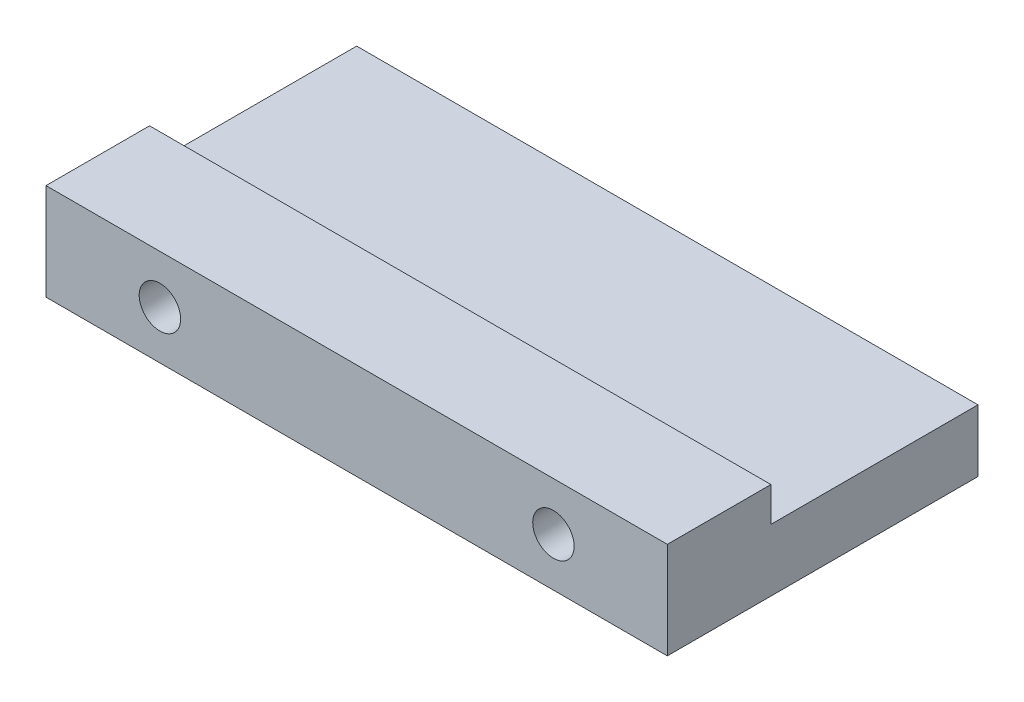
ISO-10303-21;
HEADER;
FILE_DESCRIPTION(('STEP AP214'),'2;1');
FILE_NAME('part.step','',(''),(''),'','','');
FILE_SCHEMA(('AUTOMOTIVE_DESIGN { 1 0 10303 214 1 1 1 1 }'));
ENDSEC;
DATA;
#1=APPLICATION_CONTEXT('core data for automotive mechanical design processes');
#2=APPLICATION_PROTOCOL_DEFINITION('international standard','automotive_design',2000,#1);
#3=PRODUCT_CONTEXT('',#1,'mechanical');
#4=PRODUCT('Part','Part','',(#3));
#5=PRODUCT_RELATED_PRODUCT_CATEGORY('part','',(#4));
#6=PRODUCT_DEFINITION_FORMATION('','',#4);
#7=PRODUCT_DEFINITION_CONTEXT('part definition',#1,'design');
#8=PRODUCT_DEFINITION('design','',#6,#7);
#9=PRODUCT_DEFINITION_SHAPE('','',#8);
#10=(LENGTH_UNIT() NAMED_UNIT(*) SI_UNIT(.MILLI.,.METRE.));
#11=(NAMED_UNIT(*) PLANE_ANGLE_UNIT() SI_UNIT($,.RADIAN.));
#12=(NAMED_UNIT(*) SI_UNIT($,.STERADIAN.) SOLID_ANGLE_UNIT());
#13=UNCERTAINTY_MEASURE_WITH_UNIT(LENGTH_MEASURE(1.E-05),#10,'distance_accuracy_value','');
#14=(GEOMETRIC_REPRESENTATION_CONTEXT(3) GLOBAL_UNCERTAINTY_ASSIGNED_CONTEXT((#13)) GLOBAL_UNIT_ASSIGNED_CONTEXT((#10,
#11,#12)) REPRESENTATION_CONTEXT('',''));
#15=CARTESIAN_POINT('',(0.,0.,0.));
#16=DIRECTION('',(0.,0.,1.));
#17=DIRECTION('',(1.,0.,0.));
#18=AXIS2_PLACEMENT_3D('',#15,#16,#17);
#19=CARTESIAN_POINT('',(147.,-14.,60.));
#20=DIRECTION('',(0.,0.,-1.));
#21=DIRECTION('',(-1.,0.,0.));
#22=AXIS2_PLACEMENT_3D('',#19,#20,#21);
#23=PLANE('',#22);
#24=DIRECTION('',(1.,0.,0.));
#25=VECTOR('',#24,1.);
#26=CARTESIAN_POINT('',(180.,-10.,60.));
#27=LINE('',#26,#25);
#28=CARTESIAN_POINT('',(142.527864045,-10.,60.));
#29=VERTEX_POINT('',#28);
#30=CARTESIAN_POINT('',(151.472135955,-10.,60.));
#31=VERTEX_POINT('',#30);
#32=EDGE_CURVE('E185',#29,#31,#27,.T.);
#33=ORIENTED_EDGE('',*,*,#32,.F.);
#34=CARTESIAN_POINT('',(147.,-14.,60.));
#35=DIRECTION('',(0.,0.,1.));
#36=DIRECTION('',(-1.,0.,0.));
#37=AXIS2_PLACEMENT_3D('',#34,#35,#36);
#38=CIRCLE('',#37,6.00000000000004);
#39=EDGE_CURVE('E120',#29,#31,#38,.T.);
#40=ORIENTED_EDGE('',*,*,#39,.T.);
#41=EDGE_LOOP('',(#33,#40));
#42=FACE_BOUND('',#41,.T.);
#43=ADVANCED_FACE('F31',(#42),#23,.F.);
#44=CARTESIAN_POINT('',(0.,0.,90.));
#45=DIRECTION('',(1.,0.,0.));
#46=DIRECTION('',(0.,1.,0.));
#47=AXIS2_PLACEMENT_3D('',#44,#45,#46);
#48=PLANE('',#47);
#49=DIRECTION('',(0.,0.,-1.));
#50=VECTOR('',#49,1.);
#51=CARTESIAN_POINT('',(0.,0.,90.));
#52=LINE('',#51,#50);
#53=CARTESIAN_POINT('',(0.,0.,90.));
#54=VERTEX_POINT('',#53);
#55=CARTESIAN_POINT('',(0.,0.,60.));
#56=VERTEX_POINT('',#55);
#57=EDGE_CURVE('E128',#54,#56,#52,.T.);
#58=ORIENTED_EDGE('',*,*,#57,.T.);
#59=DIRECTION('',(0.,1.,0.));
#60=VECTOR('',#59,1.);
#61=CARTESIAN_POINT('',(0.,-10.,60.));
#62=LINE('',#61,#60);
#63=CARTESIAN_POINT('',(0.,-10.,60.));
#64=VERTEX_POINT('',#63);
#65=EDGE_CURVE('E111',#64,#56,#62,.T.);
#66=ORIENTED_EDGE('',*,*,#65,.F.);
#67=DIRECTION('',(0.,0.,1.));
#68=VECTOR('',#67,1.);
#69=CARTESIAN_POINT('',(0.,-10.,0.));
#70=LINE('',#69,#68);
#71=CARTESIAN_POINT('',(0.,-10.,0.));
#72=VERTEX_POINT('',#71);
#73=EDGE_CURVE('E97',#72,#64,#70,.T.);
#74=ORIENTED_EDGE('',*,*,#73,.F.);
#75=DIRECTION('',(0.,-1.,0.));
#76=VECTOR('',#75,1.);
#77=CARTESIAN_POINT('',(0.,0.,0.));
#78=LINE('',#77,#76);
#79=CARTESIAN_POINT('',(0.,-28.,0.));
#80=VERTEX_POINT('',#79);
#81=EDGE_CURVE('E109',#72,#80,#78,.T.);
#82=ORIENTED_EDGE('',*,*,#81,.T.);
#83=DIRECTION('',(0.,0.,-1.));
#84=VECTOR('',#83,1.);
#85=CARTESIAN_POINT('',(0.,-28.,90.));
#86=LINE('',#85,#84);
#87=CARTESIAN_POINT('',(0.,-28.,90.));
#88=VERTEX_POINT('',#87);
#89=EDGE_CURVE('E11',#88,#80,#86,.T.);
#90=ORIENTED_EDGE('',*,*,#89,.F.);
#91=DIRECTION('',(0.,-1.,0.));
#92=VECTOR('',#91,1.);
#93=CARTESIAN_POINT('',(0.,0.,90.));
#94=LINE('',#93,#92);
#95=EDGE_CURVE('E127',#54,#88,#94,.T.);
#96=ORIENTED_EDGE('',*,*,#95,.F.);
#97=EDGE_LOOP('',(#58,#66,#74,#82,#90,#96));
#98=FACE_BOUND('',#97,.T.);
#99=ADVANCED_FACE('F33',(#98),#48,.F.);
#100=CARTESIAN_POINT('',(0.,-28.,90.));
#101=DIRECTION('',(0.,1.,0.));
#102=DIRECTION('',(0.,0.,1.));
#103=AXIS2_PLACEMENT_3D('',#100,#101,#102);
#104=PLANE('',#103);
#105=DIRECTION('',(1.,0.,0.));
#106=VECTOR('',#105,1.);
#107=CARTESIAN_POINT('',(0.,-28.,0.));
#108=LINE('',#107,#106);
#109=CARTESIAN_POINT('',(180.,-28.,0.));
#110=VERTEX_POINT('',#109);
#111=EDGE_CURVE('E115',#80,#110,#108,.T.);
#112=ORIENTED_EDGE('',*,*,#111,.T.);
#113=DIRECTION('',(0.,0.,-1.));
#114=VECTOR('',#113,1.);
#115=CARTESIAN_POINT('',(180.,-28.,90.));
#116=LINE('',#115,#114);
#117=CARTESIAN_POINT('',(180.,-28.,90.));
#118=VERTEX_POINT('',#117);
#119=EDGE_CURVE('E39',#118,#110,#116,.T.);
#120=ORIENTED_EDGE('',*,*,#119,.F.);
#121=DIRECTION('',(1.,0.,0.));
#122=VECTOR('',#121,1.);
#123=CARTESIAN_POINT('',(0.,-28.,90.));
#124=LINE('',#123,#122);
#125=EDGE_CURVE('E141',#88,#118,#124,.T.);
#126=ORIENTED_EDGE('',*,*,#125,.F.);
#127=ORIENTED_EDGE('',*,*,#89,.T.);
#128=EDGE_LOOP('',(#112,#120,#126,#127));
#129=FACE_BOUND('',#128,.T.);
#130=ADVANCED_FACE('F140',(#129),#104,.F.);
#131=CARTESIAN_POINT('',(180.,0.,90.));
#132=DIRECTION('',(-1.,0.,0.));
#133=DIRECTION('',(0.,0.,1.));
#134=AXIS2_PLACEMENT_3D('',#131,#132,#133);
#135=PLANE('',#134);
#136=DIRECTION('',(0.,0.,-1.));
#137=VECTOR('',#136,1.);
#138=CARTESIAN_POINT('',(180.,-10.,0.));
#139=LINE('',#138,#137);
#140=CARTESIAN_POINT('',(180.,-10.,60.));
#141=VERTEX_POINT('',#140);
#142=CARTESIAN_POINT('',(180.,-10.,0.));
#143=VERTEX_POINT('',#142);
#144=EDGE_CURVE('E99',#141,#143,#139,.T.);
#145=ORIENTED_EDGE('',*,*,#144,.F.);
#146=DIRECTION('',(0.,1.,0.));
#147=VECTOR('',#146,1.);
#148=CARTESIAN_POINT('',(180.,-10.,60.));
#149=LINE('',#148,#147);
#150=CARTESIAN_POINT('',(180.,0.,60.));
#151=VERTEX_POINT('',#150);
#152=EDGE_CURVE('E163',#141,#151,#149,.T.);
#153=ORIENTED_EDGE('',*,*,#152,.T.);
#154=DIRECTION('',(0.,0.,-1.));
#155=VECTOR('',#154,1.);
#156=CARTESIAN_POINT('',(180.,0.,90.));
#157=LINE('',#156,#155);
#158=CARTESIAN_POINT('',(180.,0.,90.));
#159=VERTEX_POINT('',#158);
#160=EDGE_CURVE('E130',#159,#151,#157,.T.);
#161=ORIENTED_EDGE('',*,*,#160,.F.);
#162=DIRECTION('',(0.,1.,0.));
#163=VECTOR('',#162,1.);
#164=CARTESIAN_POINT('',(180.,0.,90.));
#165=LINE('',#164,#163);
#166=EDGE_CURVE('E138',#118,#159,#165,.T.);
#167=ORIENTED_EDGE('',*,*,#166,.F.);
#168=ORIENTED_EDGE('',*,*,#119,.T.);
#169=DIRECTION('',(0.,1.,0.));
#170=VECTOR('',#169,1.);
#171=CARTESIAN_POINT('',(180.,0.,0.));
#172=LINE('',#171,#170);
#173=EDGE_CURVE('E118',#110,#143,#172,.T.);
#174=ORIENTED_EDGE('',*,*,#173,.T.);
#175=EDGE_LOOP('',(#145,#153,#161,#167,#168,#174));
#176=FACE_BOUND('',#175,.T.);
#177=ADVANCED_FACE('F136',(#176),#135,.F.);
#178=CARTESIAN_POINT('',(0.,0.,90.));
#179=DIRECTION('',(0.,-1.,0.));
#180=DIRECTION('',(0.,0.,-1.));
#181=AXIS2_PLACEMENT_3D('',#178,#179,#180);
#182=PLANE('',#181);
#183=ORIENTED_EDGE('',*,*,#160,.T.);
#184=DIRECTION('',(1.,0.,0.));
#185=VECTOR('',#184,1.);
#186=CARTESIAN_POINT('',(180.,0.,60.));
#187=LINE('',#186,#185);
#188=EDGE_CURVE('E155',#56,#151,#187,.T.);
#189=ORIENTED_EDGE('',*,*,#188,.F.);
#190=ORIENTED_EDGE('',*,*,#57,.F.);
#191=DIRECTION('',(-1.,0.,0.));
#192=VECTOR('',#191,1.);
#193=CARTESIAN_POINT('',(0.,0.,90.));
#194=LINE('',#193,#192);
#195=EDGE_CURVE('E123',#159,#54,#194,.T.);
#196=ORIENTED_EDGE('',*,*,#195,.F.);
#197=EDGE_LOOP('',(#183,#189,#190,#196));
#198=FACE_BOUND('',#197,.T.);
#199=ADVANCED_FACE('F154',(#198),#182,.F.);
#200=CARTESIAN_POINT('',(0.,-28.,90.));
#201=DIRECTION('',(0.,0.,1.));
#202=DIRECTION('',(1.,0.,0.));
#203=AXIS2_PLACEMENT_3D('',#200,#201,#202);
#204=PLANE('',#203);
#205=CARTESIAN_POINT('',(33.,-14.,90.));
#206=DIRECTION('',(0.,0.,1.));
#207=DIRECTION('',(1.,0.,0.));
#208=AXIS2_PLACEMENT_3D('',#205,#206,#207);
#209=CIRCLE('',#208,6.);
#210=CARTESIAN_POINT('',(39.,-14.,90.));
#211=VERTEX_POINT('',#210);
#212=EDGE_CURVE('E165',#211,#211,#209,.T.);
#213=ORIENTED_EDGE('',*,*,#212,.F.);
#214=EDGE_LOOP('',(#213));
#215=FACE_BOUND('',#214,.T.);
#216=CARTESIAN_POINT('',(147.,-14.,90.));
#217=DIRECTION('',(0.,0.,1.));
#218=DIRECTION('',(-1.,0.,0.));
#219=AXIS2_PLACEMENT_3D('',#216,#217,#218);
#220=CIRCLE('',#219,6.00000000000004);
#221=CARTESIAN_POINT('',(141.,-14.,90.));
#222=VERTEX_POINT('',#221);
#223=EDGE_CURVE('E149',#222,#222,#220,.T.);
#224=ORIENTED_EDGE('',*,*,#223,.F.);
#225=EDGE_LOOP('',(#224));
#226=FACE_BOUND('',#225,.T.);
#227=ORIENTED_EDGE('',*,*,#95,.T.);
#228=ORIENTED_EDGE('',*,*,#125,.T.);
#229=ORIENTED_EDGE('',*,*,#166,.T.);
#230=ORIENTED_EDGE('',*,*,#195,.T.);
#231=EDGE_LOOP('',(#227,#228,#229,#230));
#232=FACE_BOUND('',#231,.T.);
#233=ADVANCED_FACE('F151',(#215,#226,#232),#204,.T.);
#234=CARTESIAN_POINT('',(0.,-28.,0.));
#235=DIRECTION('',(0.,0.,1.));
#236=DIRECTION('',(1.,0.,0.));
#237=AXIS2_PLACEMENT_3D('',#234,#235,#236);
#238=PLANE('',#237);
#239=ORIENTED_EDGE('',*,*,#81,.F.);
#240=DIRECTION('',(-1.,0.,0.));
#241=VECTOR('',#240,1.);
#242=CARTESIAN_POINT('',(180.,-10.,0.));
#243=LINE('',#242,#241);
#244=EDGE_CURVE('E94',#143,#72,#243,.T.);
#245=ORIENTED_EDGE('',*,*,#244,.F.);
#246=ORIENTED_EDGE('',*,*,#173,.F.);
#247=ORIENTED_EDGE('',*,*,#111,.F.);
#248=EDGE_LOOP('',(#239,#245,#246,#247));
#249=FACE_BOUND('',#248,.T.);
#250=ADVANCED_FACE('F114',(#249),#238,.F.);
#251=CARTESIAN_POINT('',(147.,-14.,60.));
#252=DIRECTION('',(0.,0.,1.));
#253=DIRECTION('',(1.,0.,0.));
#254=AXIS2_PLACEMENT_3D('',#251,#252,#253);
#255=CYLINDRICAL_SURFACE('',#254,6.00000000000004);
#256=EDGE_CURVE('E116',#31,#29,#38,.T.);
#257=ORIENTED_EDGE('',*,*,#256,.F.);
#258=ORIENTED_EDGE('',*,*,#39,.F.);
#259=EDGE_LOOP('',(#257,#258));
#260=FACE_BOUND('',#259,.T.);
#261=ORIENTED_EDGE('',*,*,#223,.T.);
#262=EDGE_LOOP('',(#261));
#263=FACE_BOUND('',#262,.T.);
#264=ADVANCED_FACE('F190',(#260,#263),#255,.F.);
#265=CARTESIAN_POINT('',(33.,-14.,60.));
#266=DIRECTION('',(0.,0.,1.));
#267=DIRECTION('',(1.,0.,0.));
#268=AXIS2_PLACEMENT_3D('',#265,#266,#267);
#269=CYLINDRICAL_SURFACE('',#268,6.);
#270=CARTESIAN_POINT('',(33.,-14.,60.));
#271=DIRECTION('',(0.,0.,1.));
#272=DIRECTION('',(1.,0.,0.));
#273=AXIS2_PLACEMENT_3D('',#270,#271,#272);
#274=CIRCLE('',#273,6.);
#275=CARTESIAN_POINT('',(37.4721359549997,-10.,60.));
#276=VERTEX_POINT('',#275);
#277=CARTESIAN_POINT('',(28.5278640450005,-10.,60.));
#278=VERTEX_POINT('',#277);
#279=EDGE_CURVE('E167',#276,#278,#274,.T.);
#280=ORIENTED_EDGE('',*,*,#279,.F.);
#281=EDGE_CURVE('E169',#278,#276,#274,.T.);
#282=ORIENTED_EDGE('',*,*,#281,.F.);
#283=EDGE_LOOP('',(#280,#282));
#284=FACE_BOUND('',#283,.T.);
#285=ORIENTED_EDGE('',*,*,#212,.T.);
#286=EDGE_LOOP('',(#285));
#287=FACE_BOUND('',#286,.T.);
#288=ADVANCED_FACE('F181',(#284,#287),#269,.F.);
#289=CARTESIAN_POINT('',(33.,-14.,60.));
#290=DIRECTION('',(0.,0.,1.));
#291=DIRECTION('',(1.,0.,0.));
#292=AXIS2_PLACEMENT_3D('',#289,#290,#291);
#293=PLANE('',#292);
#294=EDGE_CURVE('E179',#278,#276,#27,.T.);
#295=ORIENTED_EDGE('',*,*,#294,.F.);
#296=ORIENTED_EDGE('',*,*,#281,.T.);
#297=EDGE_LOOP('',(#295,#296));
#298=FACE_BOUND('',#297,.T.);
#299=ADVANCED_FACE('F178',(#298),#293,.T.);
#300=CARTESIAN_POINT('',(180.,-10.,60.));
#301=DIRECTION('',(0.,0.,1.));
#302=DIRECTION('',(1.,0.,0.));
#303=AXIS2_PLACEMENT_3D('',#300,#301,#302);
#304=PLANE('',#303);
#305=ORIENTED_EDGE('',*,*,#256,.T.);
#306=EDGE_CURVE('E46',#276,#29,#27,.T.);
#307=ORIENTED_EDGE('',*,*,#306,.F.);
#308=ORIENTED_EDGE('',*,*,#279,.T.);
#309=EDGE_CURVE('E52',#64,#278,#27,.T.);
#310=ORIENTED_EDGE('',*,*,#309,.F.);
#311=ORIENTED_EDGE('',*,*,#65,.T.);
#312=ORIENTED_EDGE('',*,*,#188,.T.);
#313=ORIENTED_EDGE('',*,*,#152,.F.);
#314=EDGE_CURVE('E112',#31,#141,#27,.T.);
#315=ORIENTED_EDGE('',*,*,#314,.F.);
#316=EDGE_LOOP('',(#305,#307,#308,#310,#311,#312,#313,#315));
#317=FACE_BOUND('',#316,.T.);
#318=ADVANCED_FACE('F182',(#317),#304,.F.);
#319=CARTESIAN_POINT('',(180.,-10.,0.));
#320=DIRECTION('',(0.,-1.,0.));
#321=DIRECTION('',(0.,0.,-1.));
#322=AXIS2_PLACEMENT_3D('',#319,#320,#321);
#323=PLANE('',#322);
#324=ORIENTED_EDGE('',*,*,#144,.T.);
#325=ORIENTED_EDGE('',*,*,#244,.T.);
#326=ORIENTED_EDGE('',*,*,#73,.T.);
#327=ORIENTED_EDGE('',*,*,#309,.T.);
#328=ORIENTED_EDGE('',*,*,#294,.T.);
#329=ORIENTED_EDGE('',*,*,#306,.T.);
#330=ORIENTED_EDGE('',*,*,#32,.T.);
#331=ORIENTED_EDGE('',*,*,#314,.T.);
#332=EDGE_LOOP('',(#324,#325,#326,#327,#328,#329,#330,#331));
#333=FACE_BOUND('',#332,.T.);
#334=ADVANCED_FACE('F96',(#333),#323,.F.);
#335=CLOSED_SHELL('',(#43,#99,#130,#177,#199,#233,#250,#264,#288,#299,#318,#334));
#336=MANIFOLD_SOLID_BREP('B2',#335);
#337=ADVANCED_BREP_SHAPE_REPRESENTATION('',(#18,#336),#14);
#338=SHAPE_DEFINITION_REPRESENTATION(#9,#337);
ENDSEC;
END-ISO-10303-21;
